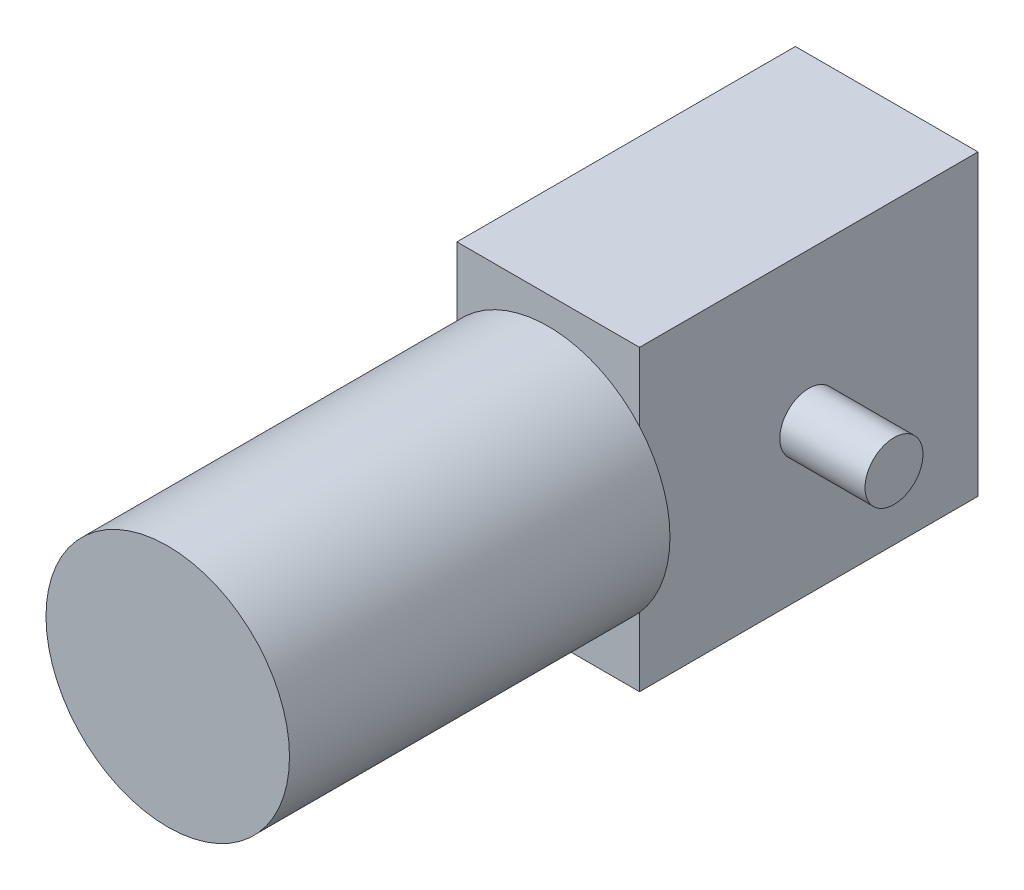
ISO-10303-21;
HEADER;
FILE_DESCRIPTION(('STEP AP214'),'2;1');
FILE_NAME('part.step','',(''),(''),'','','');
FILE_SCHEMA(('AUTOMOTIVE_DESIGN { 1 0 10303 214 1 1 1 1 }'));
ENDSEC;
DATA;
#1=APPLICATION_CONTEXT('core data for automotive mechanical design processes');
#2=APPLICATION_PROTOCOL_DEFINITION('international standard','automotive_design',2000,#1);
#3=PRODUCT_CONTEXT('',#1,'mechanical');
#4=PRODUCT('Part','Part','',(#3));
#5=PRODUCT_RELATED_PRODUCT_CATEGORY('part','',(#4));
#6=PRODUCT_DEFINITION_FORMATION('','',#4);
#7=PRODUCT_DEFINITION_CONTEXT('part definition',#1,'design');
#8=PRODUCT_DEFINITION('design','',#6,#7);
#9=PRODUCT_DEFINITION_SHAPE('','',#8);
#10=(LENGTH_UNIT() NAMED_UNIT(*) SI_UNIT(.MILLI.,.METRE.));
#11=(NAMED_UNIT(*) PLANE_ANGLE_UNIT() SI_UNIT($,.RADIAN.));
#12=(NAMED_UNIT(*) SI_UNIT($,.STERADIAN.) SOLID_ANGLE_UNIT());
#13=UNCERTAINTY_MEASURE_WITH_UNIT(LENGTH_MEASURE(1.E-05),#10,'distance_accuracy_value','');
#14=(GEOMETRIC_REPRESENTATION_CONTEXT(3) GLOBAL_UNCERTAINTY_ASSIGNED_CONTEXT((#13)) GLOBAL_UNIT_ASSIGNED_CONTEXT((#10,
#11,#12)) REPRESENTATION_CONTEXT('',''));
#15=CARTESIAN_POINT('',(0.,0.,0.));
#16=DIRECTION('',(0.,0.,1.));
#17=DIRECTION('',(1.,0.,0.));
#18=AXIS2_PLACEMENT_3D('',#15,#16,#17);
#19=CARTESIAN_POINT('',(116.,0.,0.));
#20=DIRECTION('',(-1.,0.,0.));
#21=DIRECTION('',(0.,0.,1.));
#22=AXIS2_PLACEMENT_3D('',#19,#20,#21);
#23=CYLINDRICAL_SURFACE('',#22,19.05);
#24=CARTESIAN_POINT('',(116.,0.,0.));
#25=DIRECTION('',(1.,0.,0.));
#26=DIRECTION('',(0.,0.,-1.));
#27=AXIS2_PLACEMENT_3D('',#24,#25,#26);
#28=CIRCLE('',#27,19.05);
#29=CARTESIAN_POINT('',(116.,0.,19.05));
#30=VERTEX_POINT('',#29);
#31=EDGE_CURVE('E11',#30,#30,#28,.T.);
#32=CARTESIAN_POINT('',(-116.,0.,0.));
#33=DIRECTION('',(1.,0.,0.));
#34=DIRECTION('',(0.,0.,-1.));
#35=AXIS2_PLACEMENT_3D('',#32,#33,#34);
#36=CIRCLE('',#35,19.05);
#37=CARTESIAN_POINT('',(-116.,0.,19.05));
#38=VERTEX_POINT('',#37);
#39=EDGE_CURVE('E50',#38,#38,#36,.T.);
#40=CARTESIAN_POINT('',(116.,0.,19.05));
#41=CARTESIAN_POINT('',(113.583333333333,0.,19.05));
#42=CARTESIAN_POINT('',(111.166666666667,0.,19.05));
#43=CARTESIAN_POINT('',(106.333333333333,0.,19.05));
#44=CARTESIAN_POINT('',(103.916666666667,0.,19.05));
#45=CARTESIAN_POINT('',(99.0833333333333,0.,19.05));
#46=CARTESIAN_POINT('',(96.6666666666667,0.,19.05));
#47=CARTESIAN_POINT('',(91.8333333333333,0.,19.05));
#48=CARTESIAN_POINT('',(89.4166666666667,0.,19.05));
#49=CARTESIAN_POINT('',(84.5833333333333,0.,19.05));
#50=CARTESIAN_POINT('',(82.1666666666667,0.,19.05));
#51=CARTESIAN_POINT('',(77.3333333333333,0.,19.05));
#52=CARTESIAN_POINT('',(74.9166666666667,0.,19.05));
#53=CARTESIAN_POINT('',(70.0833333333333,0.,19.05));
#54=CARTESIAN_POINT('',(67.6666666666667,0.,19.05));
#55=CARTESIAN_POINT('',(62.8333333333333,0.,19.05));
#56=CARTESIAN_POINT('',(60.4166666666667,0.,19.05));
#57=CARTESIAN_POINT('',(55.5833333333333,0.,19.05));
#58=CARTESIAN_POINT('',(53.1666666666667,0.,19.05));
#59=CARTESIAN_POINT('',(48.3333333333333,0.,19.05));
#60=CARTESIAN_POINT('',(45.9166666666667,0.,19.05));
#61=CARTESIAN_POINT('',(41.0833333333333,0.,19.05));
#62=CARTESIAN_POINT('',(38.6666666666667,0.,19.05));
#63=CARTESIAN_POINT('',(33.8333333333333,0.,19.05));
#64=CARTESIAN_POINT('',(31.4166666666667,0.,19.05));
#65=CARTESIAN_POINT('',(26.5833333333333,0.,19.05));
#66=CARTESIAN_POINT('',(24.1666666666667,0.,19.05));
#67=CARTESIAN_POINT('',(19.3333333333333,0.,19.05));
#68=CARTESIAN_POINT('',(16.9166666666667,0.,19.05));
#69=CARTESIAN_POINT('',(12.0833333333333,0.,19.05));
#70=CARTESIAN_POINT('',(9.66666666666667,0.,19.05));
#71=CARTESIAN_POINT('',(4.83333333333334,0.,19.05));
#72=CARTESIAN_POINT('',(2.41666666666667,0.,19.05));
#73=CARTESIAN_POINT('',(-2.41666666666667,0.,19.05));
#74=CARTESIAN_POINT('',(-4.83333333333334,0.,19.05));
#75=CARTESIAN_POINT('',(-9.66666666666667,0.,19.05));
#76=CARTESIAN_POINT('',(-12.0833333333333,0.,19.05));
#77=CARTESIAN_POINT('',(-16.9166666666667,0.,19.05));
#78=CARTESIAN_POINT('',(-19.3333333333333,0.,19.05));
#79=CARTESIAN_POINT('',(-24.1666666666666,0.,19.05));
#80=CARTESIAN_POINT('',(-26.5833333333333,0.,19.05));
#81=CARTESIAN_POINT('',(-31.4166666666667,0.,19.05));
#82=CARTESIAN_POINT('',(-33.8333333333333,0.,19.05));
#83=CARTESIAN_POINT('',(-38.6666666666667,0.,19.05));
#84=CARTESIAN_POINT('',(-41.0833333333333,0.,19.05));
#85=CARTESIAN_POINT('',(-45.9166666666667,0.,19.05));
#86=CARTESIAN_POINT('',(-48.3333333333333,0.,19.05));
#87=CARTESIAN_POINT('',(-53.1666666666667,0.,19.05));
#88=CARTESIAN_POINT('',(-55.5833333333333,0.,19.05));
#89=CARTESIAN_POINT('',(-60.4166666666667,0.,19.05));
#90=CARTESIAN_POINT('',(-62.8333333333333,0.,19.05));
#91=CARTESIAN_POINT('',(-67.6666666666667,0.,19.05));
#92=CARTESIAN_POINT('',(-70.0833333333333,0.,19.05));
#93=CARTESIAN_POINT('',(-74.9166666666667,0.,19.05));
#94=CARTESIAN_POINT('',(-77.3333333333333,0.,19.05));
#95=CARTESIAN_POINT('',(-82.1666666666667,0.,19.05));
#96=CARTESIAN_POINT('',(-84.5833333333333,0.,19.05));
#97=CARTESIAN_POINT('',(-89.4166666666667,0.,19.05));
#98=CARTESIAN_POINT('',(-91.8333333333334,0.,19.05));
#99=CARTESIAN_POINT('',(-96.6666666666667,0.,19.05));
#100=CARTESIAN_POINT('',(-99.0833333333333,0.,19.05));
#101=CARTESIAN_POINT('',(-103.916666666667,0.,19.05));
#102=CARTESIAN_POINT('',(-106.333333333333,0.,19.05));
#103=CARTESIAN_POINT('',(-111.166666666667,0.,19.05));
#104=CARTESIAN_POINT('',(-113.583333333333,0.,19.05));
#105=CARTESIAN_POINT('',(-116.,0.,19.05));
#106=B_SPLINE_CURVE_WITH_KNOTS('',3,(#40,#41,#42,#43,#44,#45,#46,#47,#48,#49,#50,#51,#52,#53,
#54,#55,#56,#57,#58,#59,#60,#61,#62,#63,#64,#65,#66,#67,#68,#69,#70,#71,#72,#73,#74,#75,#76,#77,
#78,#79,#80,#81,#82,#83,#84,#85,#86,#87,#88,#89,#90,#91,#92,#93,#94,#95,#96,#97,#98,#99,#100,
#101,#102,#103,#104,#105),.UNSPECIFIED.,.F.,.F.,(4,2,2,2,2,2,2,2,2,2,2,2,2,2,2,2,2,2,2,2,2,2,2,
2,2,2,2,2,2,2,2,2,4),(0.,7.25000000000001,14.5,21.75,29.,36.25,43.5,50.75,58.,65.25,72.5,79.75,
87.,94.25,101.5,108.75,116.,123.25,130.5,137.75,145.,152.25,159.5,166.75,174.,181.25,188.5,
195.75,203.,210.25,217.5,224.75,232.),.UNSPECIFIED.);
#107=EDGE_CURVE('BSEAM47',#30,#38,#106,.T.);
#108=ORIENTED_EDGE('',*,*,#31,.F.);
#109=ORIENTED_EDGE('',*,*,#39,.T.);
#110=ORIENTED_EDGE('',*,*,#107,.T.);
#111=ORIENTED_EDGE('',*,*,#107,.F.);
#112=EDGE_LOOP('',(#108,#110,#109,#111));
#113=FACE_BOUND('',#112,.T.);
#114=ADVANCED_FACE('F47',(#113),#23,.T.);
#115=CARTESIAN_POINT('',(116.,0.,0.));
#116=DIRECTION('',(1.,0.,0.));
#117=DIRECTION('',(0.,0.,-1.));
#118=AXIS2_PLACEMENT_3D('',#115,#116,#117);
#119=PLANE('',#118);
#120=ORIENTED_EDGE('',*,*,#31,.T.);
#121=EDGE_LOOP('',(#120));
#122=FACE_BOUND('',#121,.T.);
#123=ADVANCED_FACE('F62',(#122),#119,.T.);
#124=CARTESIAN_POINT('',(-116.,0.,0.));
#125=DIRECTION('',(1.,0.,0.));
#126=DIRECTION('',(0.,0.,-1.));
#127=AXIS2_PLACEMENT_3D('',#124,#125,#126);
#128=PLANE('',#127);
#129=ORIENTED_EDGE('',*,*,#39,.F.);
#130=EDGE_LOOP('',(#129));
#131=FACE_BOUND('',#130,.T.);
#132=ADVANCED_FACE('F60',(#131),#128,.F.);
#133=CLOSED_SHELL('',(#114,#123,#132));
#134=MANIFOLD_SOLID_BREP('B2',#133);
#135=CARTESIAN_POINT('',(0.,0.,111.2));
#136=DIRECTION('',(0.,0.,-1.));
#137=DIRECTION('',(-1.,0.,0.));
#138=AXIS2_PLACEMENT_3D('',#135,#136,#137);
#139=PLANE('',#138);
#140=CARTESIAN_POINT('',(0.,0.,111.2));
#141=DIRECTION('',(0.,0.,1.));
#142=DIRECTION('',(1.,0.,0.));
#143=AXIS2_PLACEMENT_3D('',#140,#141,#142);
#144=CIRCLE('',#143,80.);
#145=CARTESIAN_POINT('',(60.,52.9150262212918,111.2));
#146=VERTEX_POINT('',#145);
#147=CARTESIAN_POINT('',(-60.,52.9150262212918,111.2));
#148=VERTEX_POINT('',#147);
#149=EDGE_CURVE('E99',#146,#148,#144,.T.);
#150=ORIENTED_EDGE('',*,*,#149,.F.);
#151=DIRECTION('',(0.,1.,0.));
#152=VECTOR('',#151,1.);
#153=CARTESIAN_POINT('',(60.,-98.,111.2));
#154=LINE('',#153,#152);
#155=CARTESIAN_POINT('',(60.,98.,111.2));
#156=VERTEX_POINT('',#155);
#157=EDGE_CURVE('E154',#146,#156,#154,.T.);
#158=ORIENTED_EDGE('',*,*,#157,.T.);
#159=DIRECTION('',(-1.,0.,0.));
#160=VECTOR('',#159,1.);
#161=CARTESIAN_POINT('',(-60.,98.,111.2));
#162=LINE('',#161,#160);
#163=CARTESIAN_POINT('',(-60.,98.,111.2));
#164=VERTEX_POINT('',#163);
#165=EDGE_CURVE('E151',#156,#164,#162,.T.);
#166=ORIENTED_EDGE('',*,*,#165,.T.);
#167=DIRECTION('',(0.,-1.,0.));
#168=VECTOR('',#167,1.);
#169=CARTESIAN_POINT('',(-60.,-98.,111.2));
#170=LINE('',#169,#168);
#171=EDGE_CURVE('E180',#164,#148,#170,.T.);
#172=ORIENTED_EDGE('',*,*,#171,.T.);
#173=EDGE_LOOP('',(#150,#158,#166,#172));
#174=FACE_BOUND('',#173,.T.);
#175=ADVANCED_FACE('F88',(#174),#139,.F.);
#176=CARTESIAN_POINT('',(60.,-98.,111.2));
#177=DIRECTION('',(-1.,0.,0.));
#178=DIRECTION('',(0.,0.,1.));
#179=AXIS2_PLACEMENT_3D('',#176,#177,#178);
#180=PLANE('',#179);
#181=DIRECTION('',(0.,1.,0.));
#182=VECTOR('',#181,1.);
#183=CARTESIAN_POINT('',(60.,-98.,-111.2));
#184=LINE('',#183,#182);
#185=CARTESIAN_POINT('',(60.,-98.,-111.2));
#186=VERTEX_POINT('',#185);
#187=CARTESIAN_POINT('',(60.,98.,-111.2));
#188=VERTEX_POINT('',#187);
#189=EDGE_CURVE('E186',#186,#188,#184,.T.);
#190=ORIENTED_EDGE('',*,*,#189,.T.);
#191=DIRECTION('',(0.,0.,-1.));
#192=VECTOR('',#191,1.);
#193=CARTESIAN_POINT('',(60.,98.,111.2));
#194=LINE('',#193,#192);
#195=EDGE_CURVE('E92',#156,#188,#194,.T.);
#196=ORIENTED_EDGE('',*,*,#195,.F.);
#197=ORIENTED_EDGE('',*,*,#157,.F.);
#198=CARTESIAN_POINT('',(60.,-52.9150262212918,111.2));
#199=VERTEX_POINT('',#198);
#200=EDGE_CURVE('E152',#199,#146,#154,.T.);
#201=ORIENTED_EDGE('',*,*,#200,.F.);
#202=CARTESIAN_POINT('',(60.,-98.,111.2));
#203=VERTEX_POINT('',#202);
#204=EDGE_CURVE('E142',#203,#199,#154,.T.);
#205=ORIENTED_EDGE('',*,*,#204,.F.);
#206=DIRECTION('',(0.,0.,-1.));
#207=VECTOR('',#206,1.);
#208=CARTESIAN_POINT('',(60.,-98.,111.2));
#209=LINE('',#208,#207);
#210=EDGE_CURVE('E185',#203,#186,#209,.T.);
#211=ORIENTED_EDGE('',*,*,#210,.T.);
#212=EDGE_LOOP('',(#190,#196,#197,#201,#205,#211));
#213=FACE_BOUND('',#212,.T.);
#214=ADVANCED_FACE('F90',(#213),#180,.F.);
#215=CARTESIAN_POINT('',(-60.,98.,111.2));
#216=DIRECTION('',(0.,-1.,0.));
#217=DIRECTION('',(0.,0.,-1.));
#218=AXIS2_PLACEMENT_3D('',#215,#216,#217);
#219=PLANE('',#218);
#220=DIRECTION('',(-1.,0.,0.));
#221=VECTOR('',#220,1.);
#222=CARTESIAN_POINT('',(-60.,98.,-111.2));
#223=LINE('',#222,#221);
#224=CARTESIAN_POINT('',(-60.,98.,-111.2));
#225=VERTEX_POINT('',#224);
#226=EDGE_CURVE('E189',#188,#225,#223,.T.);
#227=ORIENTED_EDGE('',*,*,#226,.T.);
#228=DIRECTION('',(0.,0.,-1.));
#229=VECTOR('',#228,1.);
#230=CARTESIAN_POINT('',(-60.,98.,111.2));
#231=LINE('',#230,#229);
#232=EDGE_CURVE('E203',#164,#225,#231,.T.);
#233=ORIENTED_EDGE('',*,*,#232,.F.);
#234=ORIENTED_EDGE('',*,*,#165,.F.);
#235=ORIENTED_EDGE('',*,*,#195,.T.);
#236=EDGE_LOOP('',(#227,#233,#234,#235));
#237=FACE_BOUND('',#236,.T.);
#238=ADVANCED_FACE('F212',(#237),#219,.F.);
#239=CARTESIAN_POINT('',(-60.,-98.,111.2));
#240=DIRECTION('',(1.,0.,0.));
#241=DIRECTION('',(0.,0.,-1.));
#242=AXIS2_PLACEMENT_3D('',#239,#240,#241);
#243=PLANE('',#242);
#244=DIRECTION('',(0.,-1.,0.));
#245=VECTOR('',#244,1.);
#246=CARTESIAN_POINT('',(-60.,-98.,-111.2));
#247=LINE('',#246,#245);
#248=CARTESIAN_POINT('',(-60.,-98.,-111.2));
#249=VERTEX_POINT('',#248);
#250=EDGE_CURVE('E192',#225,#249,#247,.T.);
#251=ORIENTED_EDGE('',*,*,#250,.T.);
#252=DIRECTION('',(0.,0.,-1.));
#253=VECTOR('',#252,1.);
#254=CARTESIAN_POINT('',(-60.,-98.,111.2));
#255=LINE('',#254,#253);
#256=CARTESIAN_POINT('',(-60.,-98.,111.2));
#257=VERTEX_POINT('',#256);
#258=EDGE_CURVE('E200',#257,#249,#255,.T.);
#259=ORIENTED_EDGE('',*,*,#258,.F.);
#260=CARTESIAN_POINT('',(-60.,-52.9150262212918,111.2));
#261=VERTEX_POINT('',#260);
#262=EDGE_CURVE('E179',#261,#257,#170,.T.);
#263=ORIENTED_EDGE('',*,*,#262,.F.);
#264=EDGE_CURVE('E112',#148,#261,#170,.T.);
#265=ORIENTED_EDGE('',*,*,#264,.F.);
#266=ORIENTED_EDGE('',*,*,#171,.F.);
#267=ORIENTED_EDGE('',*,*,#232,.T.);
#268=EDGE_LOOP('',(#251,#259,#263,#265,#266,#267));
#269=FACE_BOUND('',#268,.T.);
#270=ADVANCED_FACE('F218',(#269),#243,.F.);
#271=CARTESIAN_POINT('',(-60.,-98.,111.2));
#272=DIRECTION('',(0.,1.,0.));
#273=DIRECTION('',(0.,0.,1.));
#274=AXIS2_PLACEMENT_3D('',#271,#272,#273);
#275=PLANE('',#274);
#276=DIRECTION('',(1.,0.,0.));
#277=VECTOR('',#276,1.);
#278=CARTESIAN_POINT('',(-60.,-98.,-111.2));
#279=LINE('',#278,#277);
#280=EDGE_CURVE('E195',#249,#186,#279,.T.);
#281=ORIENTED_EDGE('',*,*,#280,.T.);
#282=ORIENTED_EDGE('',*,*,#210,.F.);
#283=DIRECTION('',(1.,0.,0.));
#284=VECTOR('',#283,1.);
#285=CARTESIAN_POINT('',(-60.,-98.,111.2));
#286=LINE('',#285,#284);
#287=EDGE_CURVE('E146',#257,#203,#286,.T.);
#288=ORIENTED_EDGE('',*,*,#287,.F.);
#289=ORIENTED_EDGE('',*,*,#258,.T.);
#290=EDGE_LOOP('',(#281,#282,#288,#289));
#291=FACE_BOUND('',#290,.T.);
#292=ADVANCED_FACE('F220',(#291),#275,.F.);
#293=EDGE_CURVE('E45',#261,#199,#144,.T.);
#294=ORIENTED_EDGE('',*,*,#293,.F.);
#295=ORIENTED_EDGE('',*,*,#262,.T.);
#296=ORIENTED_EDGE('',*,*,#287,.T.);
#297=ORIENTED_EDGE('',*,*,#204,.T.);
#298=EDGE_LOOP('',(#294,#295,#296,#297));
#299=FACE_BOUND('',#298,.T.);
#300=ADVANCED_FACE('F144',(#299),#139,.F.);
#301=CARTESIAN_POINT('',(0.,0.,-111.2));
#302=DIRECTION('',(0.,0.,-1.));
#303=DIRECTION('',(-1.,0.,0.));
#304=AXIS2_PLACEMENT_3D('',#301,#302,#303);
#305=PLANE('',#304);
#306=ORIENTED_EDGE('',*,*,#189,.F.);
#307=ORIENTED_EDGE('',*,*,#280,.F.);
#308=ORIENTED_EDGE('',*,*,#250,.F.);
#309=ORIENTED_EDGE('',*,*,#226,.F.);
#310=EDGE_LOOP('',(#306,#307,#308,#309));
#311=FACE_BOUND('',#310,.T.);
#312=ADVANCED_FACE('F216',(#311),#305,.T.);
#313=CARTESIAN_POINT('',(0.,0.,111.2));
#314=DIRECTION('',(0.,0.,1.));
#315=DIRECTION('',(1.,0.,0.));
#316=AXIS2_PLACEMENT_3D('',#313,#314,#315);
#317=PLANE('',#316);
#318=EDGE_CURVE('E163',#199,#146,#144,.T.);
#319=ORIENTED_EDGE('',*,*,#318,.F.);
#320=ORIENTED_EDGE('',*,*,#200,.T.);
#321=EDGE_LOOP('',(#319,#320));
#322=FACE_BOUND('',#321,.T.);
#323=ADVANCED_FACE('F164',(#322),#317,.F.);
#324=EDGE_CURVE('E100',#148,#261,#144,.T.);
#325=ORIENTED_EDGE('',*,*,#324,.F.);
#326=ORIENTED_EDGE('',*,*,#264,.T.);
#327=EDGE_LOOP('',(#325,#326));
#328=FACE_BOUND('',#327,.T.);
#329=ADVANCED_FACE('F241',(#328),#317,.F.);
#330=CARTESIAN_POINT('',(0.,0.,361.2));
#331=DIRECTION('',(0.,0.,-1.));
#332=DIRECTION('',(-1.,0.,0.));
#333=AXIS2_PLACEMENT_3D('',#330,#331,#332);
#334=CYLINDRICAL_SURFACE('',#333,80.);
#335=CARTESIAN_POINT('',(0.,0.,361.2));
#336=DIRECTION('',(0.,0.,1.));
#337=DIRECTION('',(1.,0.,0.));
#338=AXIS2_PLACEMENT_3D('',#335,#336,#337);
#339=CIRCLE('',#338,80.);
#340=CARTESIAN_POINT('',(80.,0.,361.2));
#341=VERTEX_POINT('',#340);
#342=EDGE_CURVE('E174',#341,#341,#339,.T.);
#343=ORIENTED_EDGE('',*,*,#342,.F.);
#344=EDGE_LOOP('',(#343));
#345=FACE_BOUND('',#344,.T.);
#346=ORIENTED_EDGE('',*,*,#149,.T.);
#347=ORIENTED_EDGE('',*,*,#324,.T.);
#348=ORIENTED_EDGE('',*,*,#293,.T.);
#349=ORIENTED_EDGE('',*,*,#318,.T.);
#350=EDGE_LOOP('',(#346,#347,#348,#349));
#351=FACE_BOUND('',#350,.T.);
#352=ADVANCED_FACE('F169',(#345,#351),#334,.T.);
#353=CARTESIAN_POINT('',(0.,0.,361.2));
#354=DIRECTION('',(0.,0.,1.));
#355=DIRECTION('',(1.,0.,0.));
#356=AXIS2_PLACEMENT_3D('',#353,#354,#355);
#357=PLANE('',#356);
#358=ORIENTED_EDGE('',*,*,#342,.T.);
#359=EDGE_LOOP('',(#358));
#360=FACE_BOUND('',#359,.T.);
#361=ADVANCED_FACE('F246',(#360),#357,.T.);
#362=CLOSED_SHELL('',(#175,#214,#238,#270,#292,#300,#312,#323,#329,#352,#361));
#363=MANIFOLD_SOLID_BREP('B6',#362);
#364=ADVANCED_BREP_SHAPE_REPRESENTATION('',(#18,#134,#363),#14);
#365=SHAPE_DEFINITION_REPRESENTATION(#9,#364);
ENDSEC;
END-ISO-10303-21;
